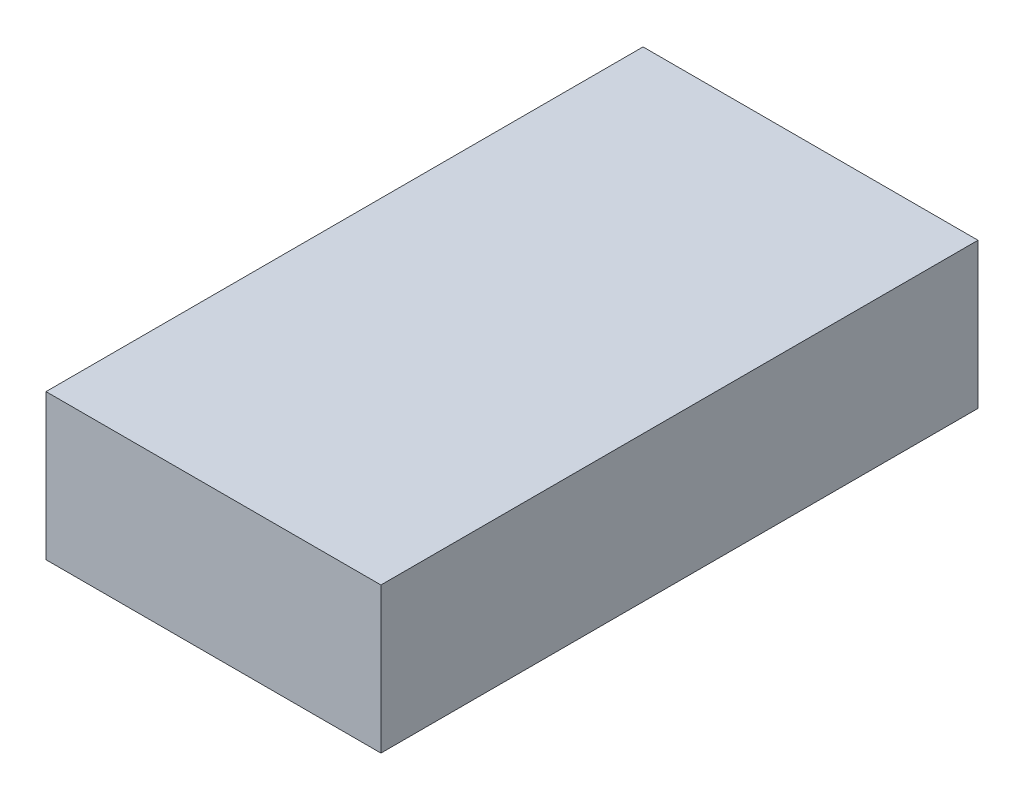
ISO-10303-21;
HEADER;
FILE_DESCRIPTION(('STEP AP214'),'2;1');
FILE_NAME('part.step','',(''),(''),'','','');
FILE_SCHEMA(('AUTOMOTIVE_DESIGN { 1 0 10303 214 1 1 1 1 }'));
ENDSEC;
DATA;
#1=APPLICATION_CONTEXT('core data for automotive mechanical design processes');
#2=APPLICATION_PROTOCOL_DEFINITION('international standard','automotive_design',2000,#1);
#3=PRODUCT_CONTEXT('',#1,'mechanical');
#4=PRODUCT('Part','Part','',(#3));
#5=PRODUCT_RELATED_PRODUCT_CATEGORY('part','',(#4));
#6=PRODUCT_DEFINITION_FORMATION('','',#4);
#7=PRODUCT_DEFINITION_CONTEXT('part definition',#1,'design');
#8=PRODUCT_DEFINITION('design','',#6,#7);
#9=PRODUCT_DEFINITION_SHAPE('','',#8);
#10=(LENGTH_UNIT() NAMED_UNIT(*) SI_UNIT(.MILLI.,.METRE.));
#11=(NAMED_UNIT(*) PLANE_ANGLE_UNIT() SI_UNIT($,.RADIAN.));
#12=(NAMED_UNIT(*) SI_UNIT($,.STERADIAN.) SOLID_ANGLE_UNIT());
#13=UNCERTAINTY_MEASURE_WITH_UNIT(LENGTH_MEASURE(1.E-05),#10,'distance_accuracy_value','');
#14=(GEOMETRIC_REPRESENTATION_CONTEXT(3) GLOBAL_UNCERTAINTY_ASSIGNED_CONTEXT((#13)) GLOBAL_UNIT_ASSIGNED_CONTEXT((#10,
#11,#12)) REPRESENTATION_CONTEXT('',''));
#15=CARTESIAN_POINT('',(0.,0.,0.));
#16=DIRECTION('',(0.,0.,1.));
#17=DIRECTION('',(1.,0.,0.));
#18=AXIS2_PLACEMENT_3D('',#15,#16,#17);
#19=CARTESIAN_POINT('',(0.,0.,205.));
#20=DIRECTION('',(1.,0.,0.));
#21=DIRECTION('',(0.,0.,-1.));
#22=AXIS2_PLACEMENT_3D('',#19,#20,#21);
#23=PLANE('',#22);
#24=DIRECTION('',(0.,-1.,0.));
#25=VECTOR('',#24,1.);
#26=CARTESIAN_POINT('',(0.,0.,0.));
#27=LINE('',#26,#25);
#28=CARTESIAN_POINT('',(0.,50.,0.));
#29=VERTEX_POINT('',#28);
#30=CARTESIAN_POINT('',(0.,0.,0.));
#31=VERTEX_POINT('',#30);
#32=EDGE_CURVE('E302',#29,#31,#27,.T.);
#33=ORIENTED_EDGE('',*,*,#32,.T.);
#34=DIRECTION('',(0.,0.,-1.));
#35=VECTOR('',#34,1.);
#36=CARTESIAN_POINT('',(0.,0.,205.));
#37=LINE('',#36,#35);
#38=CARTESIAN_POINT('',(0.,0.,205.));
#39=VERTEX_POINT('',#38);
#40=EDGE_CURVE('E11',#39,#31,#37,.T.);
#41=ORIENTED_EDGE('',*,*,#40,.F.);
#42=DIRECTION('',(0.,-1.,0.));
#43=VECTOR('',#42,1.);
#44=CARTESIAN_POINT('',(0.,0.,205.));
#45=LINE('',#44,#43);
#46=CARTESIAN_POINT('',(0.,50.,205.));
#47=VERTEX_POINT('',#46);
#48=EDGE_CURVE('E309',#47,#39,#45,.T.);
#49=ORIENTED_EDGE('',*,*,#48,.F.);
#50=DIRECTION('',(0.,0.,-1.));
#51=VECTOR('',#50,1.);
#52=CARTESIAN_POINT('',(0.,50.,205.));
#53=LINE('',#52,#51);
#54=EDGE_CURVE('E319',#47,#29,#53,.T.);
#55=ORIENTED_EDGE('',*,*,#54,.T.);
#56=EDGE_LOOP('',(#33,#41,#49,#55));
#57=FACE_BOUND('',#56,.T.);
#58=ADVANCED_FACE('F38',(#57),#23,.F.);
#59=CARTESIAN_POINT('',(0.,0.,205.));
#60=DIRECTION('',(0.,1.,0.));
#61=DIRECTION('',(0.,0.,1.));
#62=AXIS2_PLACEMENT_3D('',#59,#60,#61);
#63=PLANE('',#62);
#64=DIRECTION('',(0.,0.,-1.));
#65=VECTOR('',#64,1.);
#66=CARTESIAN_POINT('',(103.25,0.,179.5));
#67=LINE('',#66,#65);
#68=CARTESIAN_POINT('',(103.25,0.,179.5));
#69=VERTEX_POINT('',#68);
#70=CARTESIAN_POINT('',(103.25,0.,175.5));
#71=VERTEX_POINT('',#70);
#72=EDGE_CURVE('E231',#69,#71,#67,.T.);
#73=ORIENTED_EDGE('',*,*,#72,.F.);
#74=CARTESIAN_POINT('',(105.25,0.,179.5));
#75=DIRECTION('',(0.,-1.,0.));
#76=DIRECTION('',(0.,0.,1.));
#77=AXIS2_PLACEMENT_3D('',#74,#75,#76);
#78=CIRCLE('',#77,2.);
#79=CARTESIAN_POINT('',(107.25,0.,179.5));
#80=VERTEX_POINT('',#79);
#81=EDGE_CURVE('E52',#80,#69,#78,.T.);
#82=ORIENTED_EDGE('',*,*,#81,.F.);
#83=DIRECTION('',(0.,0.,1.));
#84=VECTOR('',#83,1.);
#85=CARTESIAN_POINT('',(107.25,0.,179.5));
#86=LINE('',#85,#84);
#87=CARTESIAN_POINT('',(107.25,0.,175.5));
#88=VERTEX_POINT('',#87);
#89=EDGE_CURVE('E220',#88,#80,#86,.T.);
#90=ORIENTED_EDGE('',*,*,#89,.F.);
#91=CARTESIAN_POINT('',(105.25,0.,175.5));
#92=DIRECTION('',(0.,-1.,0.));
#93=DIRECTION('',(0.,0.,1.));
#94=AXIS2_PLACEMENT_3D('',#91,#92,#93);
#95=CIRCLE('',#94,2.);
#96=EDGE_CURVE('E235',#71,#88,#95,.T.);
#97=ORIENTED_EDGE('',*,*,#96,.F.);
#98=EDGE_LOOP('',(#73,#82,#90,#97));
#99=FACE_BOUND('',#98,.T.);
#100=DIRECTION('',(0.,0.,1.));
#101=VECTOR('',#100,1.);
#102=CARTESIAN_POINT('',(11.75,0.,7.50000000000001));
#103=LINE('',#102,#101);
#104=CARTESIAN_POINT('',(11.75,0.,7.50000000000001));
#105=VERTEX_POINT('',#104);
#106=CARTESIAN_POINT('',(11.75,0.,11.5));
#107=VERTEX_POINT('',#106);
#108=EDGE_CURVE('E263',#105,#107,#103,.T.);
#109=ORIENTED_EDGE('',*,*,#108,.F.);
#110=CARTESIAN_POINT('',(9.75,0.,7.50000000000001));
#111=DIRECTION('',(0.,-1.,0.));
#112=DIRECTION('',(0.,0.,1.));
#113=AXIS2_PLACEMENT_3D('',#110,#111,#112);
#114=CIRCLE('',#113,2.);
#115=CARTESIAN_POINT('',(7.75,0.,7.50000000000001));
#116=VERTEX_POINT('',#115);
#117=EDGE_CURVE('E60',#116,#105,#114,.T.);
#118=ORIENTED_EDGE('',*,*,#117,.F.);
#119=DIRECTION('',(0.,0.,-1.));
#120=VECTOR('',#119,1.);
#121=CARTESIAN_POINT('',(7.75,0.,7.50000000000001));
#122=LINE('',#121,#120);
#123=CARTESIAN_POINT('',(7.75,0.,11.5));
#124=VERTEX_POINT('',#123);
#125=EDGE_CURVE('E252',#124,#116,#122,.T.);
#126=ORIENTED_EDGE('',*,*,#125,.F.);
#127=CARTESIAN_POINT('',(9.75,0.,11.5));
#128=DIRECTION('',(0.,-1.,0.));
#129=DIRECTION('',(0.,0.,1.));
#130=AXIS2_PLACEMENT_3D('',#127,#128,#129);
#131=CIRCLE('',#130,2.);
#132=EDGE_CURVE('E266',#107,#124,#131,.T.);
#133=ORIENTED_EDGE('',*,*,#132,.F.);
#134=EDGE_LOOP('',(#109,#118,#126,#133));
#135=FACE_BOUND('',#134,.T.);
#136=DIRECTION('',(0.,0.,1.));
#137=VECTOR('',#136,1.);
#138=CARTESIAN_POINT('',(107.25,0.,7.50000000000012));
#139=LINE('',#138,#137);
#140=CARTESIAN_POINT('',(107.25,0.,7.50000000000012));
#141=VERTEX_POINT('',#140);
#142=CARTESIAN_POINT('',(107.25,0.,11.5000000000001));
#143=VERTEX_POINT('',#142);
#144=EDGE_CURVE('E207',#141,#143,#139,.T.);
#145=ORIENTED_EDGE('',*,*,#144,.F.);
#146=CARTESIAN_POINT('',(105.25,0.,7.50000000000012));
#147=DIRECTION('',(0.,-1.,0.));
#148=DIRECTION('',(0.,0.,-1.));
#149=AXIS2_PLACEMENT_3D('',#146,#147,#148);
#150=CIRCLE('',#149,2.);
#151=CARTESIAN_POINT('',(103.25,0.,7.50000000000012));
#152=VERTEX_POINT('',#151);
#153=EDGE_CURVE('E181',#152,#141,#150,.T.);
#154=ORIENTED_EDGE('',*,*,#153,.F.);
#155=DIRECTION('',(0.,0.,-1.));
#156=VECTOR('',#155,1.);
#157=CARTESIAN_POINT('',(103.25,0.,7.50000000000012));
#158=LINE('',#157,#156);
#159=CARTESIAN_POINT('',(103.25,0.,11.5000000000001));
#160=VERTEX_POINT('',#159);
#161=EDGE_CURVE('E198',#160,#152,#158,.T.);
#162=ORIENTED_EDGE('',*,*,#161,.F.);
#163=CARTESIAN_POINT('',(105.25,0.,11.5000000000001));
#164=DIRECTION('',(0.,-1.,0.));
#165=DIRECTION('',(0.,0.,-1.));
#166=AXIS2_PLACEMENT_3D('',#163,#164,#165);
#167=CIRCLE('',#166,2.);
#168=EDGE_CURVE('E201',#143,#160,#167,.T.);
#169=ORIENTED_EDGE('',*,*,#168,.F.);
#170=EDGE_LOOP('',(#145,#154,#162,#169));
#171=FACE_BOUND('',#170,.T.);
#172=DIRECTION('',(0.,0.,-1.));
#173=VECTOR('',#172,1.);
#174=CARTESIAN_POINT('',(7.75,0.,179.5));
#175=LINE('',#174,#173);
#176=CARTESIAN_POINT('',(7.75,0.,179.5));
#177=VERTEX_POINT('',#176);
#178=CARTESIAN_POINT('',(7.75,0.,175.5));
#179=VERTEX_POINT('',#178);
#180=EDGE_CURVE('E292',#177,#179,#175,.T.);
#181=ORIENTED_EDGE('',*,*,#180,.F.);
#182=CARTESIAN_POINT('',(9.75,0.,179.5));
#183=DIRECTION('',(0.,-1.,0.));
#184=DIRECTION('',(0.,0.,-1.));
#185=AXIS2_PLACEMENT_3D('',#182,#183,#184);
#186=CIRCLE('',#185,2.);
#187=CARTESIAN_POINT('',(11.75,0.,179.5));
#188=VERTEX_POINT('',#187);
#189=EDGE_CURVE('E242',#188,#177,#186,.T.);
#190=ORIENTED_EDGE('',*,*,#189,.F.);
#191=DIRECTION('',(0.,0.,1.));
#192=VECTOR('',#191,1.);
#193=CARTESIAN_POINT('',(11.75,0.,179.5));
#194=LINE('',#193,#192);
#195=CARTESIAN_POINT('',(11.75,0.,175.5));
#196=VERTEX_POINT('',#195);
#197=EDGE_CURVE('E281',#196,#188,#194,.T.);
#198=ORIENTED_EDGE('',*,*,#197,.F.);
#199=CARTESIAN_POINT('',(9.75,0.,175.5));
#200=DIRECTION('',(0.,-1.,0.));
#201=DIRECTION('',(0.,0.,-1.));
#202=AXIS2_PLACEMENT_3D('',#199,#200,#201);
#203=CIRCLE('',#202,2.);
#204=EDGE_CURVE('E295',#179,#196,#203,.T.);
#205=ORIENTED_EDGE('',*,*,#204,.F.);
#206=EDGE_LOOP('',(#181,#190,#198,#205));
#207=FACE_BOUND('',#206,.T.);
#208=DIRECTION('',(1.,0.,0.));
#209=VECTOR('',#208,1.);
#210=CARTESIAN_POINT('',(0.,0.,0.));
#211=LINE('',#210,#209);
#212=CARTESIAN_POINT('',(115.,0.,0.));
#213=VERTEX_POINT('',#212);
#214=EDGE_CURVE('E322',#31,#213,#211,.T.);
#215=ORIENTED_EDGE('',*,*,#214,.T.);
#216=DIRECTION('',(0.,0.,-1.));
#217=VECTOR('',#216,1.);
#218=CARTESIAN_POINT('',(115.,0.,205.));
#219=LINE('',#218,#217);
#220=CARTESIAN_POINT('',(115.,0.,205.));
#221=VERTEX_POINT('',#220);
#222=EDGE_CURVE('E45',#221,#213,#219,.T.);
#223=ORIENTED_EDGE('',*,*,#222,.F.);
#224=DIRECTION('',(1.,0.,0.));
#225=VECTOR('',#224,1.);
#226=CARTESIAN_POINT('',(0.,0.,205.));
#227=LINE('',#226,#225);
#228=EDGE_CURVE('E312',#39,#221,#227,.T.);
#229=ORIENTED_EDGE('',*,*,#228,.F.);
#230=ORIENTED_EDGE('',*,*,#40,.T.);
#231=EDGE_LOOP('',(#215,#223,#229,#230));
#232=FACE_BOUND('',#231,.T.);
#233=ADVANCED_FACE('F352',(#99,#135,#171,#207,#232),#63,.F.);
#234=CARTESIAN_POINT('',(115.,0.,205.));
#235=DIRECTION('',(-1.,0.,0.));
#236=DIRECTION('',(0.,0.,1.));
#237=AXIS2_PLACEMENT_3D('',#234,#235,#236);
#238=PLANE('',#237);
#239=DIRECTION('',(0.,1.,0.));
#240=VECTOR('',#239,1.);
#241=CARTESIAN_POINT('',(115.,0.,0.));
#242=LINE('',#241,#240);
#243=CARTESIAN_POINT('',(115.,50.,0.));
#244=VERTEX_POINT('',#243);
#245=EDGE_CURVE('E324',#213,#244,#242,.T.);
#246=ORIENTED_EDGE('',*,*,#245,.T.);
#247=DIRECTION('',(0.,0.,-1.));
#248=VECTOR('',#247,1.);
#249=CARTESIAN_POINT('',(115.,50.,205.));
#250=LINE('',#249,#248);
#251=CARTESIAN_POINT('',(115.,50.,205.));
#252=VERTEX_POINT('',#251);
#253=EDGE_CURVE('E329',#252,#244,#250,.T.);
#254=ORIENTED_EDGE('',*,*,#253,.F.);
#255=DIRECTION('',(0.,1.,0.));
#256=VECTOR('',#255,1.);
#257=CARTESIAN_POINT('',(115.,0.,205.));
#258=LINE('',#257,#256);
#259=EDGE_CURVE('E315',#221,#252,#258,.T.);
#260=ORIENTED_EDGE('',*,*,#259,.F.);
#261=ORIENTED_EDGE('',*,*,#222,.T.);
#262=EDGE_LOOP('',(#246,#254,#260,#261));
#263=FACE_BOUND('',#262,.T.);
#264=ADVANCED_FACE('F336',(#263),#238,.F.);
#265=CARTESIAN_POINT('',(0.,50.,205.));
#266=DIRECTION('',(0.,-1.,0.));
#267=DIRECTION('',(0.,0.,-1.));
#268=AXIS2_PLACEMENT_3D('',#265,#266,#267);
#269=PLANE('',#268);
#270=DIRECTION('',(-1.,0.,0.));
#271=VECTOR('',#270,1.);
#272=CARTESIAN_POINT('',(0.,50.,0.));
#273=LINE('',#272,#271);
#274=EDGE_CURVE('E313',#244,#29,#273,.T.);
#275=ORIENTED_EDGE('',*,*,#274,.T.);
#276=ORIENTED_EDGE('',*,*,#54,.F.);
#277=DIRECTION('',(-1.,0.,0.));
#278=VECTOR('',#277,1.);
#279=CARTESIAN_POINT('',(0.,50.,205.));
#280=LINE('',#279,#278);
#281=EDGE_CURVE('E317',#252,#47,#280,.T.);
#282=ORIENTED_EDGE('',*,*,#281,.F.);
#283=ORIENTED_EDGE('',*,*,#253,.T.);
#284=EDGE_LOOP('',(#275,#276,#282,#283));
#285=FACE_BOUND('',#284,.T.);
#286=ADVANCED_FACE('F345',(#285),#269,.F.);
#287=CARTESIAN_POINT('',(0.,0.,205.));
#288=DIRECTION('',(0.,0.,-1.));
#289=DIRECTION('',(-1.,0.,0.));
#290=AXIS2_PLACEMENT_3D('',#287,#288,#289);
#291=PLANE('',#290);
#292=ORIENTED_EDGE('',*,*,#48,.T.);
#293=ORIENTED_EDGE('',*,*,#228,.T.);
#294=ORIENTED_EDGE('',*,*,#259,.T.);
#295=ORIENTED_EDGE('',*,*,#281,.T.);
#296=EDGE_LOOP('',(#292,#293,#294,#295));
#297=FACE_BOUND('',#296,.T.);
#298=ADVANCED_FACE('F351',(#297),#291,.F.);
#299=CARTESIAN_POINT('',(0.,0.,0.));
#300=DIRECTION('',(0.,0.,-1.));
#301=DIRECTION('',(-1.,0.,0.));
#302=AXIS2_PLACEMENT_3D('',#299,#300,#301);
#303=PLANE('',#302);
#304=ORIENTED_EDGE('',*,*,#32,.F.);
#305=ORIENTED_EDGE('',*,*,#274,.F.);
#306=ORIENTED_EDGE('',*,*,#245,.F.);
#307=ORIENTED_EDGE('',*,*,#214,.F.);
#308=EDGE_LOOP('',(#304,#305,#306,#307));
#309=FACE_BOUND('',#308,.T.);
#310=ADVANCED_FACE('F342',(#309),#303,.T.);
#311=CARTESIAN_POINT('',(9.75,5.,179.5));
#312=DIRECTION('',(0.,-1.,0.));
#313=DIRECTION('',(0.,0.,-1.));
#314=AXIS2_PLACEMENT_3D('',#311,#312,#313);
#315=CYLINDRICAL_SURFACE('',#314,2.);
#316=ORIENTED_EDGE('',*,*,#189,.T.);
#317=DIRECTION('',(0.,-1.,0.));
#318=VECTOR('',#317,1.);
#319=CARTESIAN_POINT('',(7.75,5.,179.5));
#320=LINE('',#319,#318);
#321=CARTESIAN_POINT('',(7.75,5.,179.5));
#322=VERTEX_POINT('',#321);
#323=EDGE_CURVE('E290',#322,#177,#320,.T.);
#324=ORIENTED_EDGE('',*,*,#323,.F.);
#325=CARTESIAN_POINT('',(9.75,5.,179.5));
#326=DIRECTION('',(0.,-1.,0.));
#327=DIRECTION('',(0.,0.,-1.));
#328=AXIS2_PLACEMENT_3D('',#325,#326,#327);
#329=CIRCLE('',#328,2.);
#330=CARTESIAN_POINT('',(11.75,5.,179.5));
#331=VERTEX_POINT('',#330);
#332=EDGE_CURVE('E277',#331,#322,#329,.T.);
#333=ORIENTED_EDGE('',*,*,#332,.F.);
#334=DIRECTION('',(0.,-1.,0.));
#335=VECTOR('',#334,1.);
#336=CARTESIAN_POINT('',(11.75,5.,179.5));
#337=LINE('',#336,#335);
#338=EDGE_CURVE('E300',#331,#188,#337,.T.);
#339=ORIENTED_EDGE('',*,*,#338,.T.);
#340=EDGE_LOOP('',(#316,#324,#333,#339));
#341=FACE_BOUND('',#340,.T.);
#342=ADVANCED_FACE('F367',(#341),#315,.F.);
#343=CARTESIAN_POINT('',(11.75,5.,179.5));
#344=DIRECTION('',(1.,0.,0.));
#345=DIRECTION('',(0.,0.,-1.));
#346=AXIS2_PLACEMENT_3D('',#343,#344,#345);
#347=PLANE('',#346);
#348=ORIENTED_EDGE('',*,*,#197,.T.);
#349=ORIENTED_EDGE('',*,*,#338,.F.);
#350=DIRECTION('',(0.,0.,1.));
#351=VECTOR('',#350,1.);
#352=CARTESIAN_POINT('',(11.75,5.,179.5));
#353=LINE('',#352,#351);
#354=CARTESIAN_POINT('',(11.75,5.,175.5));
#355=VERTEX_POINT('',#354);
#356=EDGE_CURVE('E287',#355,#331,#353,.T.);
#357=ORIENTED_EDGE('',*,*,#356,.F.);
#358=DIRECTION('',(0.,-1.,0.));
#359=VECTOR('',#358,1.);
#360=CARTESIAN_POINT('',(11.75,5.,175.5));
#361=LINE('',#360,#359);
#362=EDGE_CURVE('E303',#355,#196,#361,.T.);
#363=ORIENTED_EDGE('',*,*,#362,.T.);
#364=EDGE_LOOP('',(#348,#349,#357,#363));
#365=FACE_BOUND('',#364,.T.);
#366=ADVANCED_FACE('F372',(#365),#347,.F.);
#367=CARTESIAN_POINT('',(9.75,5.,175.5));
#368=DIRECTION('',(0.,-1.,0.));
#369=DIRECTION('',(0.,0.,-1.));
#370=AXIS2_PLACEMENT_3D('',#367,#368,#369);
#371=CYLINDRICAL_SURFACE('',#370,2.);
#372=ORIENTED_EDGE('',*,*,#204,.T.);
#373=ORIENTED_EDGE('',*,*,#362,.F.);
#374=CARTESIAN_POINT('',(9.75,5.,175.5));
#375=DIRECTION('',(0.,-1.,0.));
#376=DIRECTION('',(0.,0.,-1.));
#377=AXIS2_PLACEMENT_3D('',#374,#375,#376);
#378=CIRCLE('',#377,2.);
#379=CARTESIAN_POINT('',(7.75,5.,175.5));
#380=VERTEX_POINT('',#379);
#381=EDGE_CURVE('E284',#380,#355,#378,.T.);
#382=ORIENTED_EDGE('',*,*,#381,.F.);
#383=DIRECTION('',(0.,-1.,0.));
#384=VECTOR('',#383,1.);
#385=CARTESIAN_POINT('',(7.75,5.,175.5));
#386=LINE('',#385,#384);
#387=EDGE_CURVE('E305',#380,#179,#386,.T.);
#388=ORIENTED_EDGE('',*,*,#387,.T.);
#389=EDGE_LOOP('',(#372,#373,#382,#388));
#390=FACE_BOUND('',#389,.T.);
#391=ADVANCED_FACE('F378',(#390),#371,.F.);
#392=CARTESIAN_POINT('',(7.75,5.,179.5));
#393=DIRECTION('',(-1.,0.,0.));
#394=DIRECTION('',(0.,0.,1.));
#395=AXIS2_PLACEMENT_3D('',#392,#393,#394);
#396=PLANE('',#395);
#397=ORIENTED_EDGE('',*,*,#180,.T.);
#398=ORIENTED_EDGE('',*,*,#387,.F.);
#399=DIRECTION('',(0.,0.,-1.));
#400=VECTOR('',#399,1.);
#401=CARTESIAN_POINT('',(7.75,5.,179.5));
#402=LINE('',#401,#400);
#403=EDGE_CURVE('E280',#322,#380,#402,.T.);
#404=ORIENTED_EDGE('',*,*,#403,.F.);
#405=ORIENTED_EDGE('',*,*,#323,.T.);
#406=EDGE_LOOP('',(#397,#398,#404,#405));
#407=FACE_BOUND('',#406,.T.);
#408=ADVANCED_FACE('F374',(#407),#396,.F.);
#409=CARTESIAN_POINT('',(9.75,5.,179.5));
#410=DIRECTION('',(0.,-1.,0.));
#411=DIRECTION('',(0.,0.,-1.));
#412=AXIS2_PLACEMENT_3D('',#409,#410,#411);
#413=PLANE('',#412);
#414=ORIENTED_EDGE('',*,*,#332,.T.);
#415=ORIENTED_EDGE('',*,*,#403,.T.);
#416=ORIENTED_EDGE('',*,*,#381,.T.);
#417=ORIENTED_EDGE('',*,*,#356,.T.);
#418=EDGE_LOOP('',(#414,#415,#416,#417));
#419=FACE_BOUND('',#418,.T.);
#420=ADVANCED_FACE('F377',(#419),#413,.T.);
#421=CARTESIAN_POINT('',(105.25,5.,7.50000000000012));
#422=DIRECTION('',(0.,-1.,0.));
#423=DIRECTION('',(0.,0.,-1.));
#424=AXIS2_PLACEMENT_3D('',#421,#422,#423);
#425=CYLINDRICAL_SURFACE('',#424,2.);
#426=ORIENTED_EDGE('',*,*,#153,.T.);
#427=DIRECTION('',(0.,-1.,0.));
#428=VECTOR('',#427,1.);
#429=CARTESIAN_POINT('',(107.25,5.,7.50000000000012));
#430=LINE('',#429,#428);
#431=CARTESIAN_POINT('',(107.25,5.,7.50000000000012));
#432=VERTEX_POINT('',#431);
#433=EDGE_CURVE('E174',#432,#141,#430,.T.);
#434=ORIENTED_EDGE('',*,*,#433,.F.);
#435=CARTESIAN_POINT('',(105.25,5.,7.50000000000012));
#436=DIRECTION('',(0.,-1.,0.));
#437=DIRECTION('',(0.,0.,-1.));
#438=AXIS2_PLACEMENT_3D('',#435,#436,#437);
#439=CIRCLE('',#438,2.);
#440=CARTESIAN_POINT('',(103.25,5.,7.50000000000012));
#441=VERTEX_POINT('',#440);
#442=EDGE_CURVE('E178',#441,#432,#439,.T.);
#443=ORIENTED_EDGE('',*,*,#442,.F.);
#444=DIRECTION('',(0.,-1.,0.));
#445=VECTOR('',#444,1.);
#446=CARTESIAN_POINT('',(103.25,5.,7.50000000000012));
#447=LINE('',#446,#445);
#448=EDGE_CURVE('E211',#441,#152,#447,.T.);
#449=ORIENTED_EDGE('',*,*,#448,.T.);
#450=EDGE_LOOP('',(#426,#434,#443,#449));
#451=FACE_BOUND('',#450,.T.);
#452=ADVANCED_FACE('F176',(#451),#425,.F.);
#453=CARTESIAN_POINT('',(103.25,5.,7.50000000000012));
#454=DIRECTION('',(-1.,0.,0.));
#455=DIRECTION('',(0.,0.,1.));
#456=AXIS2_PLACEMENT_3D('',#453,#454,#455);
#457=PLANE('',#456);
#458=ORIENTED_EDGE('',*,*,#161,.T.);
#459=ORIENTED_EDGE('',*,*,#448,.F.);
#460=DIRECTION('',(0.,0.,-1.));
#461=VECTOR('',#460,1.);
#462=CARTESIAN_POINT('',(103.25,5.,7.50000000000012));
#463=LINE('',#462,#461);
#464=CARTESIAN_POINT('',(103.25,5.,11.5000000000001));
#465=VERTEX_POINT('',#464);
#466=EDGE_CURVE('E186',#465,#441,#463,.T.);
#467=ORIENTED_EDGE('',*,*,#466,.F.);
#468=DIRECTION('',(0.,-1.,0.));
#469=VECTOR('',#468,1.);
#470=CARTESIAN_POINT('',(103.25,5.,11.5000000000001));
#471=LINE('',#470,#469);
#472=EDGE_CURVE('E213',#465,#160,#471,.T.);
#473=ORIENTED_EDGE('',*,*,#472,.T.);
#474=EDGE_LOOP('',(#458,#459,#467,#473));
#475=FACE_BOUND('',#474,.T.);
#476=ADVANCED_FACE('F429',(#475),#457,.F.);
#477=CARTESIAN_POINT('',(105.25,5.,11.5000000000001));
#478=DIRECTION('',(0.,-1.,0.));
#479=DIRECTION('',(0.,0.,-1.));
#480=AXIS2_PLACEMENT_3D('',#477,#478,#479);
#481=CYLINDRICAL_SURFACE('',#480,2.);
#482=ORIENTED_EDGE('',*,*,#168,.T.);
#483=ORIENTED_EDGE('',*,*,#472,.F.);
#484=CARTESIAN_POINT('',(105.25,5.,11.5000000000001));
#485=DIRECTION('',(0.,-1.,0.));
#486=DIRECTION('',(0.,0.,-1.));
#487=AXIS2_PLACEMENT_3D('',#484,#485,#486);
#488=CIRCLE('',#487,2.);
#489=CARTESIAN_POINT('',(107.25,5.,11.5000000000001));
#490=VERTEX_POINT('',#489);
#491=EDGE_CURVE('E194',#490,#465,#488,.T.);
#492=ORIENTED_EDGE('',*,*,#491,.F.);
#493=DIRECTION('',(0.,-1.,0.));
#494=VECTOR('',#493,1.);
#495=CARTESIAN_POINT('',(107.25,5.,11.5000000000001));
#496=LINE('',#495,#494);
#497=EDGE_CURVE('E185',#490,#143,#496,.T.);
#498=ORIENTED_EDGE('',*,*,#497,.T.);
#499=EDGE_LOOP('',(#482,#483,#492,#498));
#500=FACE_BOUND('',#499,.T.);
#501=ADVANCED_FACE('F432',(#500),#481,.F.);
#502=CARTESIAN_POINT('',(107.25,5.,7.50000000000012));
#503=DIRECTION('',(1.,0.,0.));
#504=DIRECTION('',(0.,0.,-1.));
#505=AXIS2_PLACEMENT_3D('',#502,#503,#504);
#506=PLANE('',#505);
#507=ORIENTED_EDGE('',*,*,#144,.T.);
#508=ORIENTED_EDGE('',*,*,#497,.F.);
#509=DIRECTION('',(0.,0.,1.));
#510=VECTOR('',#509,1.);
#511=CARTESIAN_POINT('',(107.25,5.,7.50000000000012));
#512=LINE('',#511,#510);
#513=EDGE_CURVE('E189',#432,#490,#512,.T.);
#514=ORIENTED_EDGE('',*,*,#513,.F.);
#515=ORIENTED_EDGE('',*,*,#433,.T.);
#516=EDGE_LOOP('',(#507,#508,#514,#515));
#517=FACE_BOUND('',#516,.T.);
#518=ADVANCED_FACE('F190',(#517),#506,.F.);
#519=CARTESIAN_POINT('',(105.25,5.,7.50000000000012));
#520=DIRECTION('',(0.,-1.,0.));
#521=DIRECTION('',(0.,0.,-1.));
#522=AXIS2_PLACEMENT_3D('',#519,#520,#521);
#523=PLANE('',#522);
#524=ORIENTED_EDGE('',*,*,#442,.T.);
#525=ORIENTED_EDGE('',*,*,#513,.T.);
#526=ORIENTED_EDGE('',*,*,#491,.T.);
#527=ORIENTED_EDGE('',*,*,#466,.T.);
#528=EDGE_LOOP('',(#524,#525,#526,#527));
#529=FACE_BOUND('',#528,.T.);
#530=ADVANCED_FACE('F196',(#529),#523,.T.);
#531=CARTESIAN_POINT('',(9.75,5.,7.50000000000001));
#532=DIRECTION('',(0.,-1.,0.));
#533=DIRECTION('',(0.,0.,-1.));
#534=AXIS2_PLACEMENT_3D('',#531,#532,#533);
#535=CYLINDRICAL_SURFACE('',#534,2.);
#536=ORIENTED_EDGE('',*,*,#117,.T.);
#537=DIRECTION('',(0.,-1.,0.));
#538=VECTOR('',#537,1.);
#539=CARTESIAN_POINT('',(11.75,5.,7.50000000000001));
#540=LINE('',#539,#538);
#541=CARTESIAN_POINT('',(11.75,5.,7.50000000000001));
#542=VERTEX_POINT('',#541);
#543=EDGE_CURVE('E261',#542,#105,#540,.T.);
#544=ORIENTED_EDGE('',*,*,#543,.F.);
#545=CARTESIAN_POINT('',(9.75,5.,7.50000000000001));
#546=DIRECTION('',(0.,-1.,0.));
#547=DIRECTION('',(0.,0.,1.));
#548=AXIS2_PLACEMENT_3D('',#545,#546,#547);
#549=CIRCLE('',#548,2.);
#550=CARTESIAN_POINT('',(7.75,5.,7.50000000000001));
#551=VERTEX_POINT('',#550);
#552=EDGE_CURVE('E248',#551,#542,#549,.T.);
#553=ORIENTED_EDGE('',*,*,#552,.F.);
#554=DIRECTION('',(0.,-1.,0.));
#555=VECTOR('',#554,1.);
#556=CARTESIAN_POINT('',(7.75,5.,7.50000000000001));
#557=LINE('',#556,#555);
#558=EDGE_CURVE('E232',#551,#116,#557,.T.);
#559=ORIENTED_EDGE('',*,*,#558,.T.);
#560=EDGE_LOOP('',(#536,#544,#553,#559));
#561=FACE_BOUND('',#560,.T.);
#562=ADVANCED_FACE('F389',(#561),#535,.F.);
#563=CARTESIAN_POINT('',(7.75,5.,7.50000000000001));
#564=DIRECTION('',(-1.,0.,0.));
#565=DIRECTION('',(0.,0.,1.));
#566=AXIS2_PLACEMENT_3D('',#563,#564,#565);
#567=PLANE('',#566);
#568=ORIENTED_EDGE('',*,*,#125,.T.);
#569=ORIENTED_EDGE('',*,*,#558,.F.);
#570=DIRECTION('',(0.,0.,-1.));
#571=VECTOR('',#570,1.);
#572=CARTESIAN_POINT('',(7.75,5.,7.50000000000001));
#573=LINE('',#572,#571);
#574=CARTESIAN_POINT('',(7.75,5.,11.5));
#575=VERTEX_POINT('',#574);
#576=EDGE_CURVE('E258',#575,#551,#573,.T.);
#577=ORIENTED_EDGE('',*,*,#576,.F.);
#578=DIRECTION('',(0.,-1.,0.));
#579=VECTOR('',#578,1.);
#580=CARTESIAN_POINT('',(7.75,5.,11.5));
#581=LINE('',#580,#579);
#582=EDGE_CURVE('E272',#575,#124,#581,.T.);
#583=ORIENTED_EDGE('',*,*,#582,.T.);
#584=EDGE_LOOP('',(#568,#569,#577,#583));
#585=FACE_BOUND('',#584,.T.);
#586=ADVANCED_FACE('F392',(#585),#567,.F.);
#587=CARTESIAN_POINT('',(9.75,5.,11.5));
#588=DIRECTION('',(0.,-1.,0.));
#589=DIRECTION('',(0.,0.,-1.));
#590=AXIS2_PLACEMENT_3D('',#587,#588,#589);
#591=CYLINDRICAL_SURFACE('',#590,2.);
#592=ORIENTED_EDGE('',*,*,#132,.T.);
#593=ORIENTED_EDGE('',*,*,#582,.F.);
#594=CARTESIAN_POINT('',(9.75,5.,11.5));
#595=DIRECTION('',(0.,-1.,0.));
#596=DIRECTION('',(0.,0.,1.));
#597=AXIS2_PLACEMENT_3D('',#594,#595,#596);
#598=CIRCLE('',#597,2.);
#599=CARTESIAN_POINT('',(11.75,5.,11.5));
#600=VERTEX_POINT('',#599);
#601=EDGE_CURVE('E255',#600,#575,#598,.T.);
#602=ORIENTED_EDGE('',*,*,#601,.F.);
#603=DIRECTION('',(0.,-1.,0.));
#604=VECTOR('',#603,1.);
#605=CARTESIAN_POINT('',(11.75,5.,11.5));
#606=LINE('',#605,#604);
#607=EDGE_CURVE('E274',#600,#107,#606,.T.);
#608=ORIENTED_EDGE('',*,*,#607,.T.);
#609=EDGE_LOOP('',(#592,#593,#602,#608));
#610=FACE_BOUND('',#609,.T.);
#611=ADVANCED_FACE('F397',(#610),#591,.F.);
#612=CARTESIAN_POINT('',(11.75,5.,7.50000000000001));
#613=DIRECTION('',(1.,0.,0.));
#614=DIRECTION('',(0.,0.,-1.));
#615=AXIS2_PLACEMENT_3D('',#612,#613,#614);
#616=PLANE('',#615);
#617=ORIENTED_EDGE('',*,*,#108,.T.);
#618=ORIENTED_EDGE('',*,*,#607,.F.);
#619=DIRECTION('',(0.,0.,1.));
#620=VECTOR('',#619,1.);
#621=CARTESIAN_POINT('',(11.75,5.,7.50000000000001));
#622=LINE('',#621,#620);
#623=EDGE_CURVE('E251',#542,#600,#622,.T.);
#624=ORIENTED_EDGE('',*,*,#623,.F.);
#625=ORIENTED_EDGE('',*,*,#543,.T.);
#626=EDGE_LOOP('',(#617,#618,#624,#625));
#627=FACE_BOUND('',#626,.T.);
#628=ADVANCED_FACE('F393',(#627),#616,.F.);
#629=CARTESIAN_POINT('',(9.75,5.,7.50000000000001));
#630=DIRECTION('',(0.,1.,0.));
#631=DIRECTION('',(0.,0.,1.));
#632=AXIS2_PLACEMENT_3D('',#629,#630,#631);
#633=PLANE('',#632);
#634=ORIENTED_EDGE('',*,*,#552,.T.);
#635=ORIENTED_EDGE('',*,*,#623,.T.);
#636=ORIENTED_EDGE('',*,*,#601,.T.);
#637=ORIENTED_EDGE('',*,*,#576,.T.);
#638=EDGE_LOOP('',(#634,#635,#636,#637));
#639=FACE_BOUND('',#638,.T.);
#640=ADVANCED_FACE('F396',(#639),#633,.F.);
#641=CARTESIAN_POINT('',(105.25,5.,179.5));
#642=DIRECTION('',(0.,-1.,0.));
#643=DIRECTION('',(0.,0.,-1.));
#644=AXIS2_PLACEMENT_3D('',#641,#642,#643);
#645=CYLINDRICAL_SURFACE('',#644,2.);
#646=ORIENTED_EDGE('',*,*,#81,.T.);
#647=DIRECTION('',(0.,-1.,0.));
#648=VECTOR('',#647,1.);
#649=CARTESIAN_POINT('',(103.25,5.,179.5));
#650=LINE('',#649,#648);
#651=CARTESIAN_POINT('',(103.25,5.,179.5));
#652=VERTEX_POINT('',#651);
#653=EDGE_CURVE('E229',#652,#69,#650,.T.);
#654=ORIENTED_EDGE('',*,*,#653,.F.);
#655=CARTESIAN_POINT('',(105.25,5.,179.5));
#656=DIRECTION('',(0.,-1.,0.));
#657=DIRECTION('',(0.,0.,1.));
#658=AXIS2_PLACEMENT_3D('',#655,#656,#657);
#659=CIRCLE('',#658,2.);
#660=CARTESIAN_POINT('',(107.25,5.,179.5));
#661=VERTEX_POINT('',#660);
#662=EDGE_CURVE('E216',#661,#652,#659,.T.);
#663=ORIENTED_EDGE('',*,*,#662,.F.);
#664=DIRECTION('',(0.,-1.,0.));
#665=VECTOR('',#664,1.);
#666=CARTESIAN_POINT('',(107.25,5.,179.5));
#667=LINE('',#666,#665);
#668=EDGE_CURVE('E240',#661,#80,#667,.T.);
#669=ORIENTED_EDGE('',*,*,#668,.T.);
#670=EDGE_LOOP('',(#646,#654,#663,#669));
#671=FACE_BOUND('',#670,.T.);
#672=ADVANCED_FACE('F407',(#671),#645,.F.);
#673=CARTESIAN_POINT('',(107.25,5.,179.5));
#674=DIRECTION('',(1.,0.,0.));
#675=DIRECTION('',(0.,0.,-1.));
#676=AXIS2_PLACEMENT_3D('',#673,#674,#675);
#677=PLANE('',#676);
#678=ORIENTED_EDGE('',*,*,#89,.T.);
#679=ORIENTED_EDGE('',*,*,#668,.F.);
#680=DIRECTION('',(0.,0.,1.));
#681=VECTOR('',#680,1.);
#682=CARTESIAN_POINT('',(107.25,5.,179.5));
#683=LINE('',#682,#681);
#684=CARTESIAN_POINT('',(107.25,5.,175.5));
#685=VERTEX_POINT('',#684);
#686=EDGE_CURVE('E226',#685,#661,#683,.T.);
#687=ORIENTED_EDGE('',*,*,#686,.F.);
#688=DIRECTION('',(0.,-1.,0.));
#689=VECTOR('',#688,1.);
#690=CARTESIAN_POINT('',(107.25,5.,175.5));
#691=LINE('',#690,#689);
#692=EDGE_CURVE('E243',#685,#88,#691,.T.);
#693=ORIENTED_EDGE('',*,*,#692,.T.);
#694=EDGE_LOOP('',(#678,#679,#687,#693));
#695=FACE_BOUND('',#694,.T.);
#696=ADVANCED_FACE('F411',(#695),#677,.F.);
#697=CARTESIAN_POINT('',(105.25,5.,175.5));
#698=DIRECTION('',(0.,-1.,0.));
#699=DIRECTION('',(0.,0.,-1.));
#700=AXIS2_PLACEMENT_3D('',#697,#698,#699);
#701=CYLINDRICAL_SURFACE('',#700,2.);
#702=ORIENTED_EDGE('',*,*,#96,.T.);
#703=ORIENTED_EDGE('',*,*,#692,.F.);
#704=CARTESIAN_POINT('',(105.25,5.,175.5));
#705=DIRECTION('',(0.,-1.,0.));
#706=DIRECTION('',(0.,0.,1.));
#707=AXIS2_PLACEMENT_3D('',#704,#705,#706);
#708=CIRCLE('',#707,2.);
#709=CARTESIAN_POINT('',(103.25,5.,175.5));
#710=VERTEX_POINT('',#709);
#711=EDGE_CURVE('E223',#710,#685,#708,.T.);
#712=ORIENTED_EDGE('',*,*,#711,.F.);
#713=DIRECTION('',(0.,-1.,0.));
#714=VECTOR('',#713,1.);
#715=CARTESIAN_POINT('',(103.25,5.,175.5));
#716=LINE('',#715,#714);
#717=EDGE_CURVE('E245',#710,#71,#716,.T.);
#718=ORIENTED_EDGE('',*,*,#717,.T.);
#719=EDGE_LOOP('',(#702,#703,#712,#718));
#720=FACE_BOUND('',#719,.T.);
#721=ADVANCED_FACE('F416',(#720),#701,.F.);
#722=CARTESIAN_POINT('',(103.25,5.,179.5));
#723=DIRECTION('',(-1.,0.,0.));
#724=DIRECTION('',(0.,0.,1.));
#725=AXIS2_PLACEMENT_3D('',#722,#723,#724);
#726=PLANE('',#725);
#727=ORIENTED_EDGE('',*,*,#72,.T.);
#728=ORIENTED_EDGE('',*,*,#717,.F.);
#729=DIRECTION('',(0.,0.,-1.));
#730=VECTOR('',#729,1.);
#731=CARTESIAN_POINT('',(103.25,5.,179.5));
#732=LINE('',#731,#730);
#733=EDGE_CURVE('E219',#652,#710,#732,.T.);
#734=ORIENTED_EDGE('',*,*,#733,.F.);
#735=ORIENTED_EDGE('',*,*,#653,.T.);
#736=EDGE_LOOP('',(#727,#728,#734,#735));
#737=FACE_BOUND('',#736,.T.);
#738=ADVANCED_FACE('F412',(#737),#726,.F.);
#739=CARTESIAN_POINT('',(105.25,5.,179.5));
#740=DIRECTION('',(0.,1.,0.));
#741=DIRECTION('',(0.,0.,1.));
#742=AXIS2_PLACEMENT_3D('',#739,#740,#741);
#743=PLANE('',#742);
#744=ORIENTED_EDGE('',*,*,#662,.T.);
#745=ORIENTED_EDGE('',*,*,#733,.T.);
#746=ORIENTED_EDGE('',*,*,#711,.T.);
#747=ORIENTED_EDGE('',*,*,#686,.T.);
#748=EDGE_LOOP('',(#744,#745,#746,#747));
#749=FACE_BOUND('',#748,.T.);
#750=ADVANCED_FACE('F415',(#749),#743,.F.);
#751=CLOSED_SHELL('',(#58,#233,#264,#286,#298,#310,#342,#366,#391,#408,#420,#452,#476,#501,#518,
#530,#562,#586,#611,#628,#640,#672,#696,#721,#738,#750));
#752=MANIFOLD_SOLID_BREP('B2',#751);
#753=ADVANCED_BREP_SHAPE_REPRESENTATION('',(#18,#752),#14);
#754=SHAPE_DEFINITION_REPRESENTATION(#9,#753);
ENDSEC;
END-ISO-10303-21;
